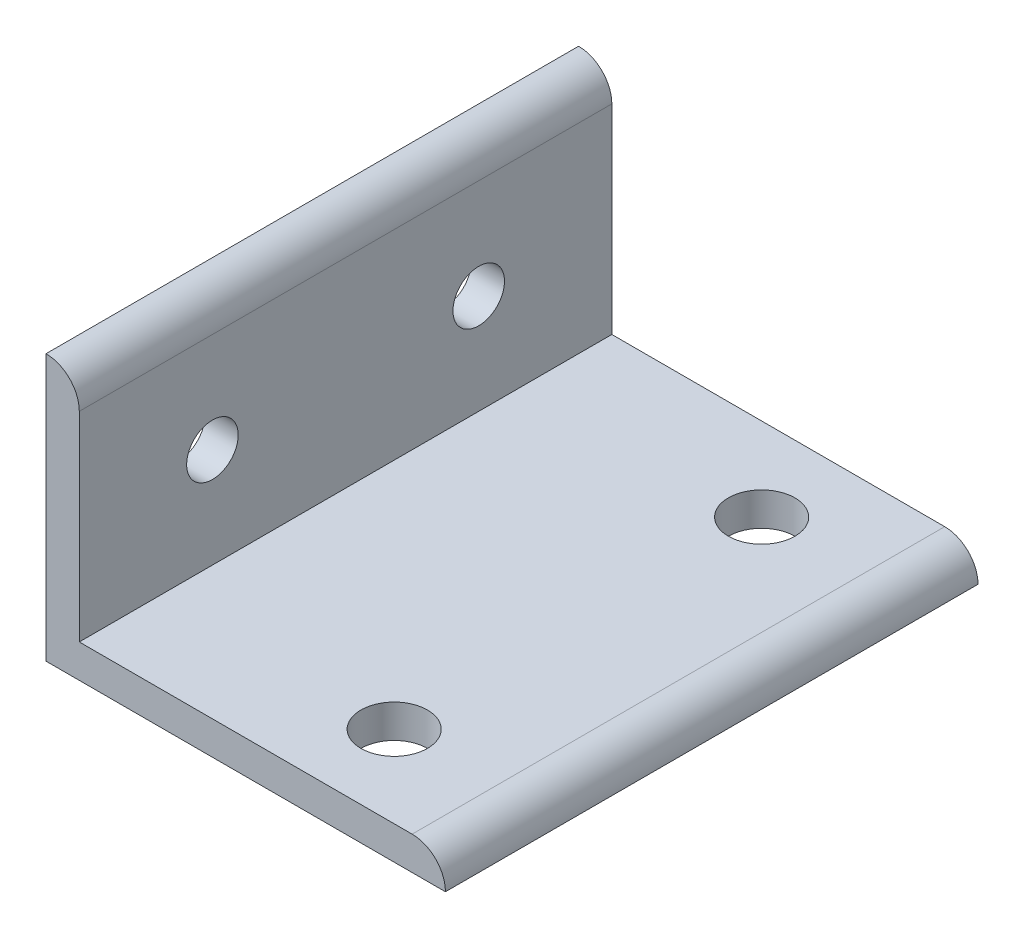
ISO-10303-21;
HEADER;
FILE_DESCRIPTION(('STEP AP214'),'2;1');
FILE_NAME('part.step','',(''),(''),'','','');
FILE_SCHEMA(('AUTOMOTIVE_DESIGN { 1 0 10303 214 1 1 1 1 }'));
ENDSEC;
DATA;
#1=APPLICATION_CONTEXT('core data for automotive mechanical design processes');
#2=APPLICATION_PROTOCOL_DEFINITION('international standard','automotive_design',2000,#1);
#3=PRODUCT_CONTEXT('',#1,'mechanical');
#4=PRODUCT('Part','Part','',(#3));
#5=PRODUCT_RELATED_PRODUCT_CATEGORY('part','',(#4));
#6=PRODUCT_DEFINITION_FORMATION('','',#4);
#7=PRODUCT_DEFINITION_CONTEXT('part definition',#1,'design');
#8=PRODUCT_DEFINITION('design','',#6,#7);
#9=PRODUCT_DEFINITION_SHAPE('','',#8);
#10=(LENGTH_UNIT() NAMED_UNIT(*) SI_UNIT(.MILLI.,.METRE.));
#11=(NAMED_UNIT(*) PLANE_ANGLE_UNIT() SI_UNIT($,.RADIAN.));
#12=(NAMED_UNIT(*) SI_UNIT($,.STERADIAN.) SOLID_ANGLE_UNIT());
#13=UNCERTAINTY_MEASURE_WITH_UNIT(LENGTH_MEASURE(1.E-05),#10,'distance_accuracy_value','');
#14=(GEOMETRIC_REPRESENTATION_CONTEXT(3) GLOBAL_UNCERTAINTY_ASSIGNED_CONTEXT((#13)) GLOBAL_UNIT_ASSIGNED_CONTEXT((#10,
#11,#12)) REPRESENTATION_CONTEXT('',''));
#15=CARTESIAN_POINT('',(0.,0.,0.));
#16=DIRECTION('',(0.,0.,1.));
#17=DIRECTION('',(1.,0.,0.));
#18=AXIS2_PLACEMENT_3D('',#15,#16,#17);
#19=CARTESIAN_POINT('',(-8.12648809523809,19.7681547619048,25.4));
#20=DIRECTION('',(1.,0.,0.));
#21=DIRECTION('',(0.,0.,-1.));
#22=AXIS2_PLACEMENT_3D('',#19,#20,#21);
#23=PLANE('',#22);
#24=CARTESIAN_POINT('',(-8.12648809523809,7.06815476190477,-12.7));
#25=DIRECTION('',(1.,0.,0.));
#26=DIRECTION('',(0.,0.,-1.));
#27=AXIS2_PLACEMENT_3D('',#24,#25,#26);
#28=CIRCLE('',#27,2.45745);
#29=CARTESIAN_POINT('',(-8.12648809523809,7.06815476190477,-15.15745));
#30=VERTEX_POINT('',#29);
#31=EDGE_CURVE('E162',#30,#30,#28,.T.);
#32=ORIENTED_EDGE('',*,*,#31,.T.);
#33=EDGE_LOOP('',(#32));
#34=FACE_BOUND('',#33,.T.);
#35=CARTESIAN_POINT('',(-8.12648809523809,7.06815476190459,12.7));
#36=DIRECTION('',(1.,0.,0.));
#37=DIRECTION('',(0.,0.,-1.));
#38=AXIS2_PLACEMENT_3D('',#35,#36,#37);
#39=CIRCLE('',#38,2.45745);
#40=CARTESIAN_POINT('',(-8.12648809523809,7.06815476190459,10.24255));
#41=VERTEX_POINT('',#40);
#42=EDGE_CURVE('E156',#41,#41,#39,.T.);
#43=ORIENTED_EDGE('',*,*,#42,.T.);
#44=EDGE_LOOP('',(#43));
#45=FACE_BOUND('',#44,.T.);
#46=DIRECTION('',(0.,-1.,0.));
#47=VECTOR('',#46,1.);
#48=CARTESIAN_POINT('',(-8.12648809523809,19.7681547619048,-25.4));
#49=LINE('',#48,#47);
#50=CARTESIAN_POINT('',(-8.12648809523809,19.7681547619048,-25.4));
#51=VERTEX_POINT('',#50);
#52=CARTESIAN_POINT('',(-8.12648809523809,-5.63184523809523,-25.4));
#53=VERTEX_POINT('',#52);
#54=EDGE_CURVE('E135',#51,#53,#49,.T.);
#55=ORIENTED_EDGE('',*,*,#54,.T.);
#56=DIRECTION('',(0.,0.,-1.));
#57=VECTOR('',#56,1.);
#58=CARTESIAN_POINT('',(-8.12648809523809,-5.63184523809523,25.4));
#59=LINE('',#58,#57);
#60=CARTESIAN_POINT('',(-8.12648809523809,-5.63184523809523,25.4));
#61=VERTEX_POINT('',#60);
#62=EDGE_CURVE('E99',#61,#53,#59,.T.);
#63=ORIENTED_EDGE('',*,*,#62,.F.);
#64=DIRECTION('',(0.,-1.,0.));
#65=VECTOR('',#64,1.);
#66=CARTESIAN_POINT('',(-8.12648809523809,19.7681547619048,25.4));
#67=LINE('',#66,#65);
#68=CARTESIAN_POINT('',(-8.12648809523809,19.7681547619048,25.4));
#69=VERTEX_POINT('',#68);
#70=EDGE_CURVE('E88',#69,#61,#67,.T.);
#71=ORIENTED_EDGE('',*,*,#70,.F.);
#72=DIRECTION('',(0.,0.,-1.));
#73=VECTOR('',#72,1.);
#74=CARTESIAN_POINT('',(-8.12648809523809,19.7681547619048,25.4));
#75=LINE('',#74,#73);
#76=EDGE_CURVE('E97',#69,#51,#75,.T.);
#77=ORIENTED_EDGE('',*,*,#76,.T.);
#78=EDGE_LOOP('',(#55,#63,#71,#77));
#79=FACE_BOUND('',#78,.T.);
#80=ADVANCED_FACE('F33',(#34,#45,#79),#23,.F.);
#81=CARTESIAN_POINT('',(-8.12648809523809,-5.63184523809523,25.4));
#82=DIRECTION('',(0.,1.,0.));
#83=DIRECTION('',(0.,0.,1.));
#84=AXIS2_PLACEMENT_3D('',#81,#82,#83);
#85=PLANE('',#84);
#86=CARTESIAN_POINT('',(17.2735119047619,-5.63184523809523,-17.4625));
#87=DIRECTION('',(0.,1.,0.));
#88=DIRECTION('',(0.,0.,1.));
#89=AXIS2_PLACEMENT_3D('',#86,#87,#88);
#90=CIRCLE('',#89,3.17499999999999);
#91=CARTESIAN_POINT('',(17.2735119047619,-5.63184523809523,-14.2875));
#92=VERTEX_POINT('',#91);
#93=EDGE_CURVE('E150',#92,#92,#90,.T.);
#94=ORIENTED_EDGE('',*,*,#93,.T.);
#95=EDGE_LOOP('',(#94));
#96=FACE_BOUND('',#95,.T.);
#97=CARTESIAN_POINT('',(17.2735119047624,-5.63184523809523,17.5895));
#98=DIRECTION('',(0.,1.,0.));
#99=DIRECTION('',(0.,0.,1.));
#100=AXIS2_PLACEMENT_3D('',#97,#98,#99);
#101=CIRCLE('',#100,3.17499999999999);
#102=CARTESIAN_POINT('',(17.2735119047624,-5.63184523809523,20.7645));
#103=VERTEX_POINT('',#102);
#104=EDGE_CURVE('E138',#103,#103,#101,.T.);
#105=ORIENTED_EDGE('',*,*,#104,.T.);
#106=EDGE_LOOP('',(#105));
#107=FACE_BOUND('',#106,.T.);
#108=DIRECTION('',(1.,0.,0.));
#109=VECTOR('',#108,1.);
#110=CARTESIAN_POINT('',(-8.12648809523809,-5.63184523809523,-25.4));
#111=LINE('',#110,#109);
#112=CARTESIAN_POINT('',(29.9735119047619,-5.63184523809523,-25.4));
#113=VERTEX_POINT('',#112);
#114=EDGE_CURVE('E131',#53,#113,#111,.T.);
#115=ORIENTED_EDGE('',*,*,#114,.T.);
#116=DIRECTION('',(0.,0.,-1.));
#117=VECTOR('',#116,1.);
#118=CARTESIAN_POINT('',(29.9735119047619,-5.63184523809523,25.4));
#119=LINE('',#118,#117);
#120=CARTESIAN_POINT('',(29.9735119047619,-5.63184523809523,25.4));
#121=VERTEX_POINT('',#120);
#122=EDGE_CURVE('E108',#121,#113,#119,.T.);
#123=ORIENTED_EDGE('',*,*,#122,.F.);
#124=DIRECTION('',(1.,0.,0.));
#125=VECTOR('',#124,1.);
#126=CARTESIAN_POINT('',(-8.12648809523809,-5.63184523809523,25.4));
#127=LINE('',#126,#125);
#128=EDGE_CURVE('E101',#61,#121,#127,.T.);
#129=ORIENTED_EDGE('',*,*,#128,.F.);
#130=ORIENTED_EDGE('',*,*,#62,.T.);
#131=EDGE_LOOP('',(#115,#123,#129,#130));
#132=FACE_BOUND('',#131,.T.);
#133=ADVANCED_FACE('F134',(#96,#107,#132),#85,.F.);
#134=CARTESIAN_POINT('',(29.9735119047619,-2.45684523809523,25.4));
#135=DIRECTION('',(0.,-1.,0.));
#136=DIRECTION('',(1.,0.,0.));
#137=AXIS2_PLACEMENT_3D('',#134,#135,#136);
#138=PLANE('',#137);
#139=CARTESIAN_POINT('',(17.2735119047619,-2.45684523809523,-17.4625));
#140=DIRECTION('',(0.,1.,0.));
#141=DIRECTION('',(0.,0.,1.));
#142=AXIS2_PLACEMENT_3D('',#139,#140,#141);
#143=CIRCLE('',#142,3.17499999999999);
#144=CARTESIAN_POINT('',(17.2735119047619,-2.45684523809523,-14.2875));
#145=VERTEX_POINT('',#144);
#146=EDGE_CURVE('E153',#145,#145,#143,.T.);
#147=ORIENTED_EDGE('',*,*,#146,.F.);
#148=EDGE_LOOP('',(#147));
#149=FACE_BOUND('',#148,.T.);
#150=CARTESIAN_POINT('',(17.2735119047624,-2.45684523809523,17.5895));
#151=DIRECTION('',(0.,1.,0.));
#152=DIRECTION('',(0.,0.,1.));
#153=AXIS2_PLACEMENT_3D('',#150,#151,#152);
#154=CIRCLE('',#153,3.17499999999999);
#155=CARTESIAN_POINT('',(17.2735119047624,-2.45684523809523,20.7645));
#156=VERTEX_POINT('',#155);
#157=EDGE_CURVE('E147',#156,#156,#154,.T.);
#158=ORIENTED_EDGE('',*,*,#157,.F.);
#159=EDGE_LOOP('',(#158));
#160=FACE_BOUND('',#159,.T.);
#161=DIRECTION('',(-1.,0.,0.));
#162=VECTOR('',#161,1.);
#163=CARTESIAN_POINT('',(29.9735119047619,-2.45684523809523,25.4));
#164=LINE('',#163,#162);
#165=CARTESIAN_POINT('',(26.7985119047619,-2.45684523809523,25.4));
#166=VERTEX_POINT('',#165);
#167=CARTESIAN_POINT('',(-4.95148809523809,-2.45684523809523,25.4));
#168=VERTEX_POINT('',#167);
#169=EDGE_CURVE('E115',#166,#168,#164,.T.);
#170=ORIENTED_EDGE('',*,*,#169,.F.);
#171=DIRECTION('',(0.,0.,-1.));
#172=VECTOR('',#171,1.);
#173=CARTESIAN_POINT('',(26.7985119047619,-2.45684523809523,25.4));
#174=LINE('',#173,#172);
#175=CARTESIAN_POINT('',(26.7985119047619,-2.45684523809523,-25.4));
#176=VERTEX_POINT('',#175);
#177=EDGE_CURVE('E104',#166,#176,#174,.T.);
#178=ORIENTED_EDGE('',*,*,#177,.T.);
#179=DIRECTION('',(-1.,0.,0.));
#180=VECTOR('',#179,1.);
#181=CARTESIAN_POINT('',(29.9735119047619,-2.45684523809523,-25.4));
#182=LINE('',#181,#180);
#183=CARTESIAN_POINT('',(-4.95148809523809,-2.45684523809523,-25.4));
#184=VERTEX_POINT('',#183);
#185=EDGE_CURVE('E132',#176,#184,#182,.T.);
#186=ORIENTED_EDGE('',*,*,#185,.T.);
#187=DIRECTION('',(0.,0.,-1.));
#188=VECTOR('',#187,1.);
#189=CARTESIAN_POINT('',(-4.95148809523809,-2.45684523809523,25.4));
#190=LINE('',#189,#188);
#191=EDGE_CURVE('E125',#168,#184,#190,.T.);
#192=ORIENTED_EDGE('',*,*,#191,.F.);
#193=EDGE_LOOP('',(#170,#178,#186,#192));
#194=FACE_BOUND('',#193,.T.);
#195=ADVANCED_FACE('F122',(#149,#160,#194),#138,.F.);
#196=CARTESIAN_POINT('',(-4.95148809523809,-2.45684523809523,25.4));
#197=DIRECTION('',(-1.,0.,0.));
#198=DIRECTION('',(0.,-1.,0.));
#199=AXIS2_PLACEMENT_3D('',#196,#197,#198);
#200=PLANE('',#199);
#201=CARTESIAN_POINT('',(-4.95148809523809,7.06815476190477,-12.7));
#202=DIRECTION('',(1.,0.,0.));
#203=DIRECTION('',(0.,0.,-1.));
#204=AXIS2_PLACEMENT_3D('',#201,#202,#203);
#205=CIRCLE('',#204,2.45745);
#206=CARTESIAN_POINT('',(-4.95148809523809,7.06815476190477,-15.15745));
#207=VERTEX_POINT('',#206);
#208=EDGE_CURVE('E165',#207,#207,#205,.T.);
#209=ORIENTED_EDGE('',*,*,#208,.F.);
#210=EDGE_LOOP('',(#209));
#211=FACE_BOUND('',#210,.T.);
#212=CARTESIAN_POINT('',(-4.95148809523809,7.06815476190459,12.7));
#213=DIRECTION('',(1.,0.,0.));
#214=DIRECTION('',(0.,0.,-1.));
#215=AXIS2_PLACEMENT_3D('',#212,#213,#214);
#216=CIRCLE('',#215,2.45745);
#217=CARTESIAN_POINT('',(-4.95148809523809,7.06815476190459,10.24255));
#218=VERTEX_POINT('',#217);
#219=EDGE_CURVE('E159',#218,#218,#216,.T.);
#220=ORIENTED_EDGE('',*,*,#219,.F.);
#221=EDGE_LOOP('',(#220));
#222=FACE_BOUND('',#221,.T.);
#223=DIRECTION('',(0.,1.,0.));
#224=VECTOR('',#223,1.);
#225=CARTESIAN_POINT('',(-4.95148809523809,-2.45684523809523,-25.4));
#226=LINE('',#225,#224);
#227=CARTESIAN_POINT('',(-4.95148809523809,16.5931547619048,-25.4));
#228=VERTEX_POINT('',#227);
#229=EDGE_CURVE('E102',#184,#228,#226,.T.);
#230=ORIENTED_EDGE('',*,*,#229,.T.);
#231=DIRECTION('',(0.,0.,-1.));
#232=VECTOR('',#231,1.);
#233=CARTESIAN_POINT('',(-4.95148809523809,16.5931547619048,25.4));
#234=LINE('',#233,#232);
#235=CARTESIAN_POINT('',(-4.95148809523809,16.5931547619048,25.4));
#236=VERTEX_POINT('',#235);
#237=EDGE_CURVE('E11',#228,#236,#234,.F.);
#238=ORIENTED_EDGE('',*,*,#237,.T.);
#239=DIRECTION('',(0.,1.,0.));
#240=VECTOR('',#239,1.);
#241=CARTESIAN_POINT('',(-4.95148809523809,-2.45684523809523,25.4));
#242=LINE('',#241,#240);
#243=EDGE_CURVE('E90',#168,#236,#242,.T.);
#244=ORIENTED_EDGE('',*,*,#243,.F.);
#245=ORIENTED_EDGE('',*,*,#191,.T.);
#246=EDGE_LOOP('',(#230,#238,#244,#245));
#247=FACE_BOUND('',#246,.T.);
#248=ADVANCED_FACE('F172',(#211,#222,#247),#200,.F.);
#249=CARTESIAN_POINT('',(0.,0.,25.4));
#250=DIRECTION('',(0.,0.,1.));
#251=DIRECTION('',(1.,0.,0.));
#252=AXIS2_PLACEMENT_3D('',#249,#250,#251);
#253=PLANE('',#252);
#254=ORIENTED_EDGE('',*,*,#128,.T.);
#255=CARTESIAN_POINT('',(26.7985119047619,-5.63184523809523,25.4));
#256=DIRECTION('',(0.,0.,1.));
#257=DIRECTION('',(1.,0.,0.));
#258=AXIS2_PLACEMENT_3D('',#255,#256,#257);
#259=CIRCLE('',#258,3.175);
#260=EDGE_CURVE('E41',#121,#166,#259,.T.);
#261=ORIENTED_EDGE('',*,*,#260,.T.);
#262=ORIENTED_EDGE('',*,*,#169,.T.);
#263=ORIENTED_EDGE('',*,*,#243,.T.);
#264=CARTESIAN_POINT('',(-8.12648809523809,16.5931547619048,25.4));
#265=DIRECTION('',(0.,0.,1.));
#266=DIRECTION('',(1.,0.,0.));
#267=AXIS2_PLACEMENT_3D('',#264,#265,#266);
#268=CIRCLE('',#267,3.175);
#269=EDGE_CURVE('E85',#236,#69,#268,.T.);
#270=ORIENTED_EDGE('',*,*,#269,.T.);
#271=ORIENTED_EDGE('',*,*,#70,.T.);
#272=EDGE_LOOP('',(#254,#261,#262,#263,#270,#271));
#273=FACE_BOUND('',#272,.T.);
#274=ADVANCED_FACE('F87',(#273),#253,.T.);
#275=CARTESIAN_POINT('',(0.,0.,-25.4));
#276=DIRECTION('',(0.,0.,1.));
#277=DIRECTION('',(1.,0.,0.));
#278=AXIS2_PLACEMENT_3D('',#275,#276,#277);
#279=PLANE('',#278);
#280=ORIENTED_EDGE('',*,*,#185,.F.);
#281=CARTESIAN_POINT('',(26.7985119047619,-5.63184523809523,-25.4));
#282=DIRECTION('',(0.,0.,1.));
#283=DIRECTION('',(1.,0.,0.));
#284=AXIS2_PLACEMENT_3D('',#281,#282,#283);
#285=CIRCLE('',#284,3.175);
#286=EDGE_CURVE('E93',#176,#113,#285,.F.);
#287=ORIENTED_EDGE('',*,*,#286,.T.);
#288=ORIENTED_EDGE('',*,*,#114,.F.);
#289=ORIENTED_EDGE('',*,*,#54,.F.);
#290=CARTESIAN_POINT('',(-8.12648809523809,16.5931547619048,-25.4));
#291=DIRECTION('',(0.,0.,1.));
#292=DIRECTION('',(1.,0.,0.));
#293=AXIS2_PLACEMENT_3D('',#290,#291,#292);
#294=CIRCLE('',#293,3.175);
#295=EDGE_CURVE('E54',#51,#228,#294,.F.);
#296=ORIENTED_EDGE('',*,*,#295,.T.);
#297=ORIENTED_EDGE('',*,*,#229,.F.);
#298=EDGE_LOOP('',(#280,#287,#288,#289,#296,#297));
#299=FACE_BOUND('',#298,.T.);
#300=ADVANCED_FACE('F130',(#299),#279,.F.);
#301=CARTESIAN_POINT('',(17.2735119047624,-2.45684523809523,17.5895));
#302=DIRECTION('',(0.,1.,0.));
#303=DIRECTION('',(0.,0.,1.));
#304=AXIS2_PLACEMENT_3D('',#301,#302,#303);
#305=CYLINDRICAL_SURFACE('',#304,3.17499999999999);
#306=ORIENTED_EDGE('',*,*,#157,.T.);
#307=EDGE_LOOP('',(#306));
#308=FACE_BOUND('',#307,.T.);
#309=ORIENTED_EDGE('',*,*,#104,.F.);
#310=EDGE_LOOP('',(#309));
#311=FACE_BOUND('',#310,.T.);
#312=ADVANCED_FACE('F205',(#308,#311),#305,.F.);
#313=CARTESIAN_POINT('',(17.2735119047619,-2.45684523809523,-17.4625));
#314=DIRECTION('',(0.,1.,0.));
#315=DIRECTION('',(0.,0.,1.));
#316=AXIS2_PLACEMENT_3D('',#313,#314,#315);
#317=CYLINDRICAL_SURFACE('',#316,3.17499999999999);
#318=ORIENTED_EDGE('',*,*,#146,.T.);
#319=EDGE_LOOP('',(#318));
#320=FACE_BOUND('',#319,.T.);
#321=ORIENTED_EDGE('',*,*,#93,.F.);
#322=EDGE_LOOP('',(#321));
#323=FACE_BOUND('',#322,.T.);
#324=ADVANCED_FACE('F181',(#320,#323),#317,.F.);
#325=CARTESIAN_POINT('',(-4.95148809523809,7.06815476190459,12.7));
#326=DIRECTION('',(1.,0.,0.));
#327=DIRECTION('',(0.,0.,-1.));
#328=AXIS2_PLACEMENT_3D('',#325,#326,#327);
#329=CYLINDRICAL_SURFACE('',#328,2.45745);
#330=ORIENTED_EDGE('',*,*,#219,.T.);
#331=EDGE_LOOP('',(#330));
#332=FACE_BOUND('',#331,.T.);
#333=ORIENTED_EDGE('',*,*,#42,.F.);
#334=EDGE_LOOP('',(#333));
#335=FACE_BOUND('',#334,.T.);
#336=ADVANCED_FACE('F178',(#332,#335),#329,.F.);
#337=CARTESIAN_POINT('',(-4.95148809523809,7.06815476190477,-12.7));
#338=DIRECTION('',(1.,0.,0.));
#339=DIRECTION('',(0.,0.,-1.));
#340=AXIS2_PLACEMENT_3D('',#337,#338,#339);
#341=CYLINDRICAL_SURFACE('',#340,2.45745);
#342=ORIENTED_EDGE('',*,*,#208,.T.);
#343=EDGE_LOOP('',(#342));
#344=FACE_BOUND('',#343,.T.);
#345=ORIENTED_EDGE('',*,*,#31,.F.);
#346=EDGE_LOOP('',(#345));
#347=FACE_BOUND('',#346,.T.);
#348=ADVANCED_FACE('F169',(#344,#347),#341,.F.);
#349=CARTESIAN_POINT('',(26.7985119047619,-5.63184523809523,25.4));
#350=DIRECTION('',(0.,0.,-1.));
#351=DIRECTION('',(-1.,0.,0.));
#352=AXIS2_PLACEMENT_3D('',#349,#350,#351);
#353=CYLINDRICAL_SURFACE('',#352,3.175);
#354=ORIENTED_EDGE('',*,*,#260,.F.);
#355=ORIENTED_EDGE('',*,*,#122,.T.);
#356=ORIENTED_EDGE('',*,*,#286,.F.);
#357=ORIENTED_EDGE('',*,*,#177,.F.);
#358=EDGE_LOOP('',(#354,#355,#356,#357));
#359=FACE_BOUND('',#358,.T.);
#360=ADVANCED_FACE('F127',(#359),#353,.T.);
#361=CARTESIAN_POINT('',(-8.12648809523809,16.5931547619048,25.4));
#362=DIRECTION('',(0.,0.,-1.));
#363=DIRECTION('',(-1.,0.,0.));
#364=AXIS2_PLACEMENT_3D('',#361,#362,#363);
#365=CYLINDRICAL_SURFACE('',#364,3.175);
#366=ORIENTED_EDGE('',*,*,#269,.F.);
#367=ORIENTED_EDGE('',*,*,#237,.F.);
#368=ORIENTED_EDGE('',*,*,#295,.F.);
#369=ORIENTED_EDGE('',*,*,#76,.F.);
#370=EDGE_LOOP('',(#366,#367,#368,#369));
#371=FACE_BOUND('',#370,.T.);
#372=ADVANCED_FACE('F35',(#371),#365,.T.);
#373=CLOSED_SHELL('',(#80,#133,#195,#248,#274,#300,#312,#324,#336,#348,#360,#372));
#374=MANIFOLD_SOLID_BREP('B2',#373);
#375=ADVANCED_BREP_SHAPE_REPRESENTATION('',(#18,#374),#14);
#376=SHAPE_DEFINITION_REPRESENTATION(#9,#375);
ENDSEC;
END-ISO-10303-21;
